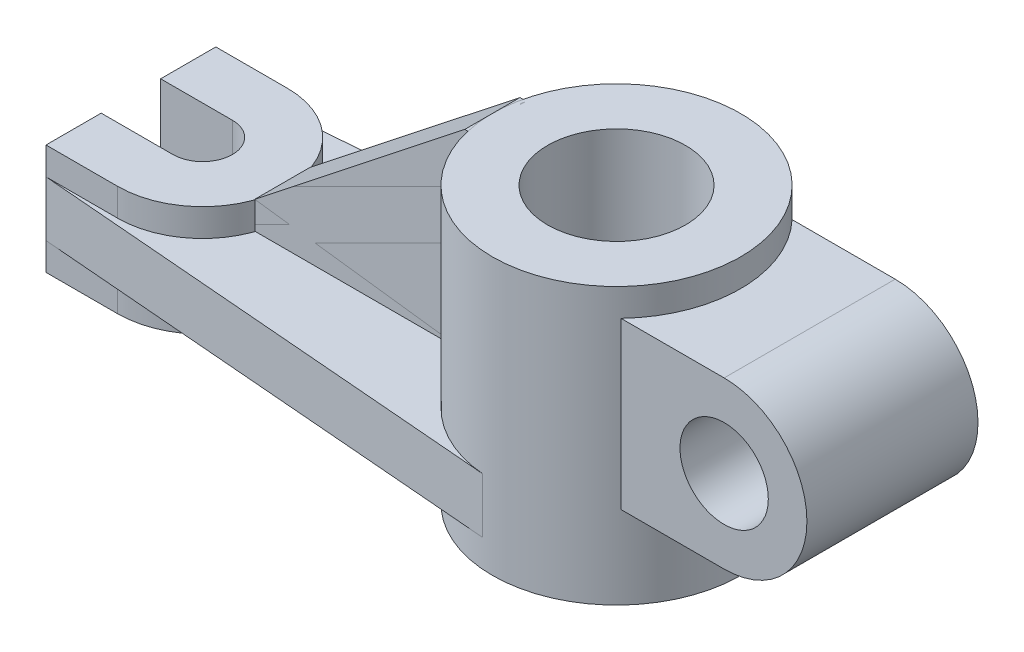
ISO-10303-21;
HEADER;
FILE_DESCRIPTION(('STEP AP214'),'2;1');
FILE_NAME('part.step','',(''),(''),'','','');
FILE_SCHEMA(('AUTOMOTIVE_DESIGN { 1 0 10303 214 1 1 1 1 }'));
ENDSEC;
DATA;
#1=APPLICATION_CONTEXT('core data for automotive mechanical design processes');
#2=APPLICATION_PROTOCOL_DEFINITION('international standard','automotive_design',2000,#1);
#3=PRODUCT_CONTEXT('',#1,'mechanical');
#4=PRODUCT('Part','Part','',(#3));
#5=PRODUCT_RELATED_PRODUCT_CATEGORY('part','',(#4));
#6=PRODUCT_DEFINITION_FORMATION('','',#4);
#7=PRODUCT_DEFINITION_CONTEXT('part definition',#1,'design');
#8=PRODUCT_DEFINITION('design','',#6,#7);
#9=PRODUCT_DEFINITION_SHAPE('','',#8);
#10=(LENGTH_UNIT() NAMED_UNIT(*) SI_UNIT(.MILLI.,.METRE.));
#11=(NAMED_UNIT(*) PLANE_ANGLE_UNIT() SI_UNIT($,.RADIAN.));
#12=(NAMED_UNIT(*) SI_UNIT($,.STERADIAN.) SOLID_ANGLE_UNIT());
#13=UNCERTAINTY_MEASURE_WITH_UNIT(LENGTH_MEASURE(1.E-05),#10,'distance_accuracy_value','');
#14=(GEOMETRIC_REPRESENTATION_CONTEXT(3) GLOBAL_UNCERTAINTY_ASSIGNED_CONTEXT((#13)) GLOBAL_UNIT_ASSIGNED_CONTEXT((#10,
#11,#12)) REPRESENTATION_CONTEXT('',''));
#15=CARTESIAN_POINT('',(0.,0.,0.));
#16=DIRECTION('',(0.,0.,1.));
#17=DIRECTION('',(1.,0.,0.));
#18=AXIS2_PLACEMENT_3D('',#15,#16,#17);
#19=CARTESIAN_POINT('',(-21.3685346332566,15.,5.));
#20=DIRECTION('',(-1.,0.,0.));
#21=DIRECTION('',(0.,-1.,0.));
#22=AXIS2_PLACEMENT_3D('',#19,#20,#21);
#23=PLANE('',#22);
#24=DIRECTION('',(0.,1.,0.));
#25=VECTOR('',#24,1.);
#26=CARTESIAN_POINT('',(-21.3685346332566,15.,-5.));
#27=LINE('',#26,#25);
#28=CARTESIAN_POINT('',(-21.3685346332566,15.,-5.));
#29=VERTEX_POINT('',#28);
#30=CARTESIAN_POINT('',(-21.3685346332566,50.,-5.));
#31=VERTEX_POINT('',#30);
#32=EDGE_CURVE('E140',#29,#31,#27,.T.);
#33=ORIENTED_EDGE('',*,*,#32,.T.);
#34=DIRECTION('',(0.,0.,-1.));
#35=VECTOR('',#34,1.);
#36=CARTESIAN_POINT('',(-21.3685346332566,50.,5.));
#37=LINE('',#36,#35);
#38=CARTESIAN_POINT('',(-21.3685346332566,50.,5.));
#39=VERTEX_POINT('',#38);
#40=EDGE_CURVE('E12',#39,#31,#37,.T.);
#41=ORIENTED_EDGE('',*,*,#40,.F.);
#42=DIRECTION('',(0.,1.,0.));
#43=VECTOR('',#42,1.);
#44=CARTESIAN_POINT('',(-21.3685346332566,15.,5.));
#45=LINE('',#44,#43);
#46=CARTESIAN_POINT('',(-21.3685346332566,15.,5.));
#47=VERTEX_POINT('',#46);
#48=EDGE_CURVE('E153',#47,#39,#45,.T.);
#49=ORIENTED_EDGE('',*,*,#48,.F.);
#50=DIRECTION('',(0.,0.,-1.));
#51=VECTOR('',#50,1.);
#52=CARTESIAN_POINT('',(-21.3685346332566,15.,5.));
#53=LINE('',#52,#51);
#54=EDGE_CURVE('E136',#47,#29,#53,.T.);
#55=ORIENTED_EDGE('',*,*,#54,.T.);
#56=EDGE_LOOP('',(#33,#41,#49,#55));
#57=FACE_BOUND('',#56,.T.);
#58=ADVANCED_FACE('F60',(#57),#23,.F.);
#59=CARTESIAN_POINT('',(-21.3685346332566,50.,5.));
#60=DIRECTION('',(0.,-1.,0.));
#61=DIRECTION('',(0.,0.,-1.));
#62=AXIS2_PLACEMENT_3D('',#59,#60,#61);
#63=PLANE('',#62);
#64=DIRECTION('',(-1.,0.,0.));
#65=VECTOR('',#64,1.);
#66=CARTESIAN_POINT('',(-21.3685346332566,50.,-5.));
#67=LINE('',#66,#65);
#68=CARTESIAN_POINT('',(-22.5,50.,-5.));
#69=VERTEX_POINT('',#68);
#70=EDGE_CURVE('E144',#31,#69,#67,.T.);
#71=ORIENTED_EDGE('',*,*,#70,.T.);
#72=DIRECTION('',(0.,0.,-1.));
#73=VECTOR('',#72,1.);
#74=CARTESIAN_POINT('',(-22.5,50.,5.));
#75=LINE('',#74,#73);
#76=CARTESIAN_POINT('',(-22.5,50.,5.));
#77=VERTEX_POINT('',#76);
#78=EDGE_CURVE('E69',#77,#69,#75,.T.);
#79=ORIENTED_EDGE('',*,*,#78,.F.);
#80=DIRECTION('',(-1.,0.,0.));
#81=VECTOR('',#80,1.);
#82=CARTESIAN_POINT('',(-21.3685346332566,50.,5.));
#83=LINE('',#82,#81);
#84=EDGE_CURVE('E111',#39,#77,#83,.T.);
#85=ORIENTED_EDGE('',*,*,#84,.F.);
#86=ORIENTED_EDGE('',*,*,#40,.T.);
#87=EDGE_LOOP('',(#71,#79,#85,#86));
#88=FACE_BOUND('',#87,.T.);
#89=ADVANCED_FACE('F176',(#88),#63,.F.);
#90=CARTESIAN_POINT('',(-22.5,50.,5.));
#91=DIRECTION('',(0.61900782089987,-0.785384821386812,0.));
#92=DIRECTION('',(0.785384821386812,0.61900782089987,0.));
#93=AXIS2_PLACEMENT_3D('',#90,#91,#92);
#94=PLANE('',#93);
#95=DIRECTION('',(-0.785384821386812,-0.61900782089987,0.));
#96=VECTOR('',#95,1.);
#97=CARTESIAN_POINT('',(-22.5,50.,-5.));
#98=LINE('',#97,#96);
#99=CARTESIAN_POINT('',(-60.5634037989249,20.,-5.));
#100=VERTEX_POINT('',#99);
#101=EDGE_CURVE('E127',#69,#100,#98,.T.);
#102=ORIENTED_EDGE('',*,*,#101,.T.);
#103=DIRECTION('',(0.,0.,-1.));
#104=VECTOR('',#103,1.);
#105=CARTESIAN_POINT('',(-60.5634037989249,20.,5.));
#106=LINE('',#105,#104);
#107=CARTESIAN_POINT('',(-60.5634037989249,20.,5.));
#108=VERTEX_POINT('',#107);
#109=EDGE_CURVE('E124',#108,#100,#106,.T.);
#110=ORIENTED_EDGE('',*,*,#109,.F.);
#111=DIRECTION('',(-0.785384821386812,-0.61900782089987,0.));
#112=VECTOR('',#111,1.);
#113=CARTESIAN_POINT('',(-22.5,50.,5.));
#114=LINE('',#113,#112);
#115=EDGE_CURVE('E115',#77,#108,#114,.T.);
#116=ORIENTED_EDGE('',*,*,#115,.F.);
#117=ORIENTED_EDGE('',*,*,#78,.T.);
#118=EDGE_LOOP('',(#102,#110,#116,#117));
#119=FACE_BOUND('',#118,.T.);
#120=ADVANCED_FACE('F125',(#119),#94,.F.);
#121=CARTESIAN_POINT('',(-60.5634037989249,20.,5.));
#122=DIRECTION('',(1.,0.,0.));
#123=DIRECTION('',(0.,0.,-1.));
#124=AXIS2_PLACEMENT_3D('',#121,#122,#123);
#125=PLANE('',#124);
#126=DIRECTION('',(0.,-1.,0.));
#127=VECTOR('',#126,1.);
#128=CARTESIAN_POINT('',(-60.5634037989249,20.,-5.));
#129=LINE('',#128,#127);
#130=CARTESIAN_POINT('',(-60.5634037989249,15.,-5.));
#131=VERTEX_POINT('',#130);
#132=EDGE_CURVE('E97',#100,#131,#129,.T.);
#133=ORIENTED_EDGE('',*,*,#132,.T.);
#134=DIRECTION('',(0.,0.,-1.));
#135=VECTOR('',#134,1.);
#136=CARTESIAN_POINT('',(-60.5634037989249,15.,5.));
#137=LINE('',#136,#135);
#138=CARTESIAN_POINT('',(-60.5634037989249,15.,5.));
#139=VERTEX_POINT('',#138);
#140=EDGE_CURVE('E129',#139,#131,#137,.T.);
#141=ORIENTED_EDGE('',*,*,#140,.F.);
#142=DIRECTION('',(0.,-1.,0.));
#143=VECTOR('',#142,1.);
#144=CARTESIAN_POINT('',(-60.5634037989249,20.,5.));
#145=LINE('',#144,#143);
#146=EDGE_CURVE('E119',#108,#139,#145,.T.);
#147=ORIENTED_EDGE('',*,*,#146,.F.);
#148=ORIENTED_EDGE('',*,*,#109,.T.);
#149=EDGE_LOOP('',(#133,#141,#147,#148));
#150=FACE_BOUND('',#149,.T.);
#151=ADVANCED_FACE('F131',(#150),#125,.F.);
#152=CARTESIAN_POINT('',(-60.5634037989249,15.,5.));
#153=DIRECTION('',(0.,1.,0.));
#154=DIRECTION('',(0.,0.,1.));
#155=AXIS2_PLACEMENT_3D('',#152,#153,#154);
#156=PLANE('',#155);
#157=DIRECTION('',(1.,0.,0.));
#158=VECTOR('',#157,1.);
#159=CARTESIAN_POINT('',(-60.5634037989249,15.,-5.));
#160=LINE('',#159,#158);
#161=EDGE_CURVE('E103',#131,#29,#160,.T.);
#162=ORIENTED_EDGE('',*,*,#161,.T.);
#163=ORIENTED_EDGE('',*,*,#54,.F.);
#164=DIRECTION('',(1.,0.,0.));
#165=VECTOR('',#164,1.);
#166=CARTESIAN_POINT('',(-60.5634037989249,15.,5.));
#167=LINE('',#166,#165);
#168=EDGE_CURVE('E77',#139,#47,#167,.T.);
#169=ORIENTED_EDGE('',*,*,#168,.F.);
#170=ORIENTED_EDGE('',*,*,#140,.T.);
#171=EDGE_LOOP('',(#162,#163,#169,#170));
#172=FACE_BOUND('',#171,.T.);
#173=ADVANCED_FACE('F165',(#172),#156,.F.);
#174=CARTESIAN_POINT('',(0.,0.,5.));
#175=DIRECTION('',(0.,0.,1.));
#176=DIRECTION('',(1.,0.,0.));
#177=AXIS2_PLACEMENT_3D('',#174,#175,#176);
#178=PLANE('',#177);
#179=ORIENTED_EDGE('',*,*,#48,.T.);
#180=ORIENTED_EDGE('',*,*,#84,.T.);
#181=ORIENTED_EDGE('',*,*,#115,.T.);
#182=ORIENTED_EDGE('',*,*,#146,.T.);
#183=ORIENTED_EDGE('',*,*,#168,.T.);
#184=EDGE_LOOP('',(#179,#180,#181,#182,#183));
#185=FACE_BOUND('',#184,.T.);
#186=ADVANCED_FACE('F117',(#185),#178,.T.);
#187=CARTESIAN_POINT('',(0.,0.,-5.));
#188=DIRECTION('',(0.,0.,1.));
#189=DIRECTION('',(1.,0.,0.));
#190=AXIS2_PLACEMENT_3D('',#187,#188,#189);
#191=PLANE('',#190);
#192=ORIENTED_EDGE('',*,*,#32,.F.);
#193=ORIENTED_EDGE('',*,*,#161,.F.);
#194=ORIENTED_EDGE('',*,*,#132,.F.);
#195=ORIENTED_EDGE('',*,*,#101,.F.);
#196=ORIENTED_EDGE('',*,*,#70,.F.);
#197=EDGE_LOOP('',(#192,#193,#194,#195,#196));
#198=FACE_BOUND('',#197,.T.);
#199=ADVANCED_FACE('F161',(#198),#191,.F.);
#200=CLOSED_SHELL('',(#58,#89,#120,#151,#173,#186,#199));
#201=MANIFOLD_SOLID_BREP('B2',#200);
#202=CARTESIAN_POINT('',(-21.3685346332566,15.,5.));
#203=DIRECTION('',(-1.,0.,0.));
#204=DIRECTION('',(0.,-1.,0.));
#205=AXIS2_PLACEMENT_3D('',#202,#203,#204);
#206=PLANE('',#205);
#207=DIRECTION('',(0.,1.,0.));
#208=VECTOR('',#207,1.);
#209=CARTESIAN_POINT('',(-21.3685346332566,15.,-5.));
#210=LINE('',#209,#208);
#211=CARTESIAN_POINT('',(-21.3685346332566,15.,-5.));
#212=VERTEX_POINT('',#211);
#213=CARTESIAN_POINT('',(-21.3685346332566,50.,-5.));
#214=VERTEX_POINT('',#213);
#215=EDGE_CURVE('E342',#212,#214,#210,.T.);
#216=ORIENTED_EDGE('',*,*,#215,.T.);
#217=DIRECTION('',(0.,0.,-1.));
#218=VECTOR('',#217,1.);
#219=CARTESIAN_POINT('',(-21.3685346332566,50.,5.));
#220=LINE('',#219,#218);
#221=CARTESIAN_POINT('',(-21.3685346332566,50.,5.));
#222=VERTEX_POINT('',#221);
#223=EDGE_CURVE('E58',#222,#214,#220,.T.);
#224=ORIENTED_EDGE('',*,*,#223,.F.);
#225=DIRECTION('',(0.,1.,0.));
#226=VECTOR('',#225,1.);
#227=CARTESIAN_POINT('',(-21.3685346332566,15.,5.));
#228=LINE('',#227,#226);
#229=CARTESIAN_POINT('',(-21.3685346332566,15.,5.));
#230=VERTEX_POINT('',#229);
#231=EDGE_CURVE('E355',#230,#222,#228,.T.);
#232=ORIENTED_EDGE('',*,*,#231,.F.);
#233=DIRECTION('',(0.,0.,-1.));
#234=VECTOR('',#233,1.);
#235=CARTESIAN_POINT('',(-21.3685346332566,15.,5.));
#236=LINE('',#235,#234);
#237=EDGE_CURVE('E338',#230,#212,#236,.T.);
#238=ORIENTED_EDGE('',*,*,#237,.T.);
#239=EDGE_LOOP('',(#216,#224,#232,#238));
#240=FACE_BOUND('',#239,.T.);
#241=ADVANCED_FACE('F262',(#240),#206,.F.);
#242=CARTESIAN_POINT('',(-21.3685346332566,50.,5.));
#243=DIRECTION('',(0.,-1.,0.));
#244=DIRECTION('',(0.,0.,-1.));
#245=AXIS2_PLACEMENT_3D('',#242,#243,#244);
#246=PLANE('',#245);
#247=DIRECTION('',(-1.,0.,0.));
#248=VECTOR('',#247,1.);
#249=CARTESIAN_POINT('',(-21.3685346332566,50.,-5.));
#250=LINE('',#249,#248);
#251=CARTESIAN_POINT('',(-22.5,50.,-5.));
#252=VERTEX_POINT('',#251);
#253=EDGE_CURVE('E346',#214,#252,#250,.T.);
#254=ORIENTED_EDGE('',*,*,#253,.T.);
#255=DIRECTION('',(0.,0.,-1.));
#256=VECTOR('',#255,1.);
#257=CARTESIAN_POINT('',(-22.5,50.,5.));
#258=LINE('',#257,#256);
#259=CARTESIAN_POINT('',(-22.5,50.,5.));
#260=VERTEX_POINT('',#259);
#261=EDGE_CURVE('E271',#260,#252,#258,.T.);
#262=ORIENTED_EDGE('',*,*,#261,.F.);
#263=DIRECTION('',(-1.,0.,0.));
#264=VECTOR('',#263,1.);
#265=CARTESIAN_POINT('',(-21.3685346332566,50.,5.));
#266=LINE('',#265,#264);
#267=EDGE_CURVE('E313',#222,#260,#266,.T.);
#268=ORIENTED_EDGE('',*,*,#267,.F.);
#269=ORIENTED_EDGE('',*,*,#223,.T.);
#270=EDGE_LOOP('',(#254,#262,#268,#269));
#271=FACE_BOUND('',#270,.T.);
#272=ADVANCED_FACE('F378',(#271),#246,.F.);
#273=CARTESIAN_POINT('',(-22.5,50.,5.));
#274=DIRECTION('',(0.61900782089987,-0.785384821386812,0.));
#275=DIRECTION('',(0.785384821386812,0.61900782089987,0.));
#276=AXIS2_PLACEMENT_3D('',#273,#274,#275);
#277=PLANE('',#276);
#278=DIRECTION('',(-0.785384821386812,-0.61900782089987,0.));
#279=VECTOR('',#278,1.);
#280=CARTESIAN_POINT('',(-22.5,50.,-5.));
#281=LINE('',#280,#279);
#282=CARTESIAN_POINT('',(-60.5634037989249,20.,-5.));
#283=VERTEX_POINT('',#282);
#284=EDGE_CURVE('E329',#252,#283,#281,.T.);
#285=ORIENTED_EDGE('',*,*,#284,.T.);
#286=DIRECTION('',(0.,0.,-1.));
#287=VECTOR('',#286,1.);
#288=CARTESIAN_POINT('',(-60.5634037989249,20.,5.));
#289=LINE('',#288,#287);
#290=CARTESIAN_POINT('',(-60.5634037989249,20.,5.));
#291=VERTEX_POINT('',#290);
#292=EDGE_CURVE('E326',#291,#283,#289,.T.);
#293=ORIENTED_EDGE('',*,*,#292,.F.);
#294=DIRECTION('',(-0.785384821386812,-0.61900782089987,0.));
#295=VECTOR('',#294,1.);
#296=CARTESIAN_POINT('',(-22.5,50.,5.));
#297=LINE('',#296,#295);
#298=EDGE_CURVE('E317',#260,#291,#297,.T.);
#299=ORIENTED_EDGE('',*,*,#298,.F.);
#300=ORIENTED_EDGE('',*,*,#261,.T.);
#301=EDGE_LOOP('',(#285,#293,#299,#300));
#302=FACE_BOUND('',#301,.T.);
#303=ADVANCED_FACE('F327',(#302),#277,.F.);
#304=CARTESIAN_POINT('',(-60.5634037989249,20.,5.));
#305=DIRECTION('',(1.,0.,0.));
#306=DIRECTION('',(0.,0.,-1.));
#307=AXIS2_PLACEMENT_3D('',#304,#305,#306);
#308=PLANE('',#307);
#309=DIRECTION('',(0.,-1.,0.));
#310=VECTOR('',#309,1.);
#311=CARTESIAN_POINT('',(-60.5634037989249,20.,-5.));
#312=LINE('',#311,#310);
#313=CARTESIAN_POINT('',(-60.5634037989249,15.,-5.));
#314=VERTEX_POINT('',#313);
#315=EDGE_CURVE('E299',#283,#314,#312,.T.);
#316=ORIENTED_EDGE('',*,*,#315,.T.);
#317=DIRECTION('',(0.,0.,-1.));
#318=VECTOR('',#317,1.);
#319=CARTESIAN_POINT('',(-60.5634037989249,15.,5.));
#320=LINE('',#319,#318);
#321=CARTESIAN_POINT('',(-60.5634037989249,15.,5.));
#322=VERTEX_POINT('',#321);
#323=EDGE_CURVE('E331',#322,#314,#320,.T.);
#324=ORIENTED_EDGE('',*,*,#323,.F.);
#325=DIRECTION('',(0.,-1.,0.));
#326=VECTOR('',#325,1.);
#327=CARTESIAN_POINT('',(-60.5634037989249,20.,5.));
#328=LINE('',#327,#326);
#329=EDGE_CURVE('E321',#291,#322,#328,.T.);
#330=ORIENTED_EDGE('',*,*,#329,.F.);
#331=ORIENTED_EDGE('',*,*,#292,.T.);
#332=EDGE_LOOP('',(#316,#324,#330,#331));
#333=FACE_BOUND('',#332,.T.);
#334=ADVANCED_FACE('F333',(#333),#308,.F.);
#335=CARTESIAN_POINT('',(-60.5634037989249,15.,5.));
#336=DIRECTION('',(0.,1.,0.));
#337=DIRECTION('',(0.,0.,1.));
#338=AXIS2_PLACEMENT_3D('',#335,#336,#337);
#339=PLANE('',#338);
#340=DIRECTION('',(1.,0.,0.));
#341=VECTOR('',#340,1.);
#342=CARTESIAN_POINT('',(-60.5634037989249,15.,-5.));
#343=LINE('',#342,#341);
#344=EDGE_CURVE('E305',#314,#212,#343,.T.);
#345=ORIENTED_EDGE('',*,*,#344,.T.);
#346=ORIENTED_EDGE('',*,*,#237,.F.);
#347=DIRECTION('',(1.,0.,0.));
#348=VECTOR('',#347,1.);
#349=CARTESIAN_POINT('',(-60.5634037989249,15.,5.));
#350=LINE('',#349,#348);
#351=EDGE_CURVE('E279',#322,#230,#350,.T.);
#352=ORIENTED_EDGE('',*,*,#351,.F.);
#353=ORIENTED_EDGE('',*,*,#323,.T.);
#354=EDGE_LOOP('',(#345,#346,#352,#353));
#355=FACE_BOUND('',#354,.T.);
#356=ADVANCED_FACE('F367',(#355),#339,.F.);
#357=CARTESIAN_POINT('',(0.,0.,5.));
#358=DIRECTION('',(0.,0.,1.));
#359=DIRECTION('',(1.,0.,0.));
#360=AXIS2_PLACEMENT_3D('',#357,#358,#359);
#361=PLANE('',#360);
#362=ORIENTED_EDGE('',*,*,#231,.T.);
#363=ORIENTED_EDGE('',*,*,#267,.T.);
#364=ORIENTED_EDGE('',*,*,#298,.T.);
#365=ORIENTED_EDGE('',*,*,#329,.T.);
#366=ORIENTED_EDGE('',*,*,#351,.T.);
#367=EDGE_LOOP('',(#362,#363,#364,#365,#366));
#368=FACE_BOUND('',#367,.T.);
#369=ADVANCED_FACE('F319',(#368),#361,.T.);
#370=CARTESIAN_POINT('',(0.,0.,-5.));
#371=DIRECTION('',(0.,0.,1.));
#372=DIRECTION('',(1.,0.,0.));
#373=AXIS2_PLACEMENT_3D('',#370,#371,#372);
#374=PLANE('',#373);
#375=ORIENTED_EDGE('',*,*,#215,.F.);
#376=ORIENTED_EDGE('',*,*,#344,.F.);
#377=ORIENTED_EDGE('',*,*,#315,.F.);
#378=ORIENTED_EDGE('',*,*,#284,.F.);
#379=ORIENTED_EDGE('',*,*,#253,.F.);
#380=EDGE_LOOP('',(#375,#376,#377,#378,#379));
#381=FACE_BOUND('',#380,.T.);
#382=ADVANCED_FACE('F363',(#381),#374,.F.);
#383=CLOSED_SHELL('',(#241,#272,#303,#334,#356,#369,#382));
#384=MANIFOLD_SOLID_BREP('B6_NOT_SHOWN',#383);
#385=CARTESIAN_POINT('',(0.,50.,0.));
#386=DIRECTION('',(0.,-1.,0.));
#387=DIRECTION('',(0.,0.,-1.));
#388=AXIS2_PLACEMENT_3D('',#385,#386,#387);
#389=CYLINDRICAL_SURFACE('',#388,22.5);
#390=DIRECTION('',(0.,-1.,0.));
#391=VECTOR('',#390,1.);
#392=CARTESIAN_POINT('',(16.3095064303001,45.,15.5));
#393=LINE('',#392,#391);
#394=CARTESIAN_POINT('',(16.3095064303001,45.,15.5));
#395=VERTEX_POINT('',#394);
#396=CARTESIAN_POINT('',(16.3095064303001,15.,15.5));
#397=VERTEX_POINT('',#396);
#398=EDGE_CURVE('E478',#395,#397,#393,.T.);
#399=ORIENTED_EDGE('',*,*,#398,.F.);
#400=CARTESIAN_POINT('',(0.,45.,0.));
#401=DIRECTION('',(0.,1.,0.));
#402=DIRECTION('',(0.,0.,1.));
#403=AXIS2_PLACEMENT_3D('',#400,#401,#402);
#404=CIRCLE('',#403,22.5);
#405=CARTESIAN_POINT('',(16.3095064303001,45.,-15.5));
#406=VERTEX_POINT('',#405);
#407=EDGE_CURVE('E473',#395,#406,#404,.T.);
#408=ORIENTED_EDGE('',*,*,#407,.T.);
#409=DIRECTION('',(0.,-1.,0.));
#410=VECTOR('',#409,1.);
#411=CARTESIAN_POINT('',(16.3095064303001,45.,-15.5));
#412=LINE('',#411,#410);
#413=CARTESIAN_POINT('',(16.3095064303001,15.,-15.5));
#414=VERTEX_POINT('',#413);
#415=EDGE_CURVE('E632',#406,#414,#412,.T.);
#416=ORIENTED_EDGE('',*,*,#415,.T.);
#417=CARTESIAN_POINT('',(0.,15.,0.));
#418=DIRECTION('',(0.,1.,0.));
#419=DIRECTION('',(0.,0.,1.));
#420=AXIS2_PLACEMENT_3D('',#417,#418,#419);
#421=CIRCLE('',#420,22.5);
#422=EDGE_CURVE('E587',#397,#414,#421,.T.);
#423=ORIENTED_EDGE('',*,*,#422,.F.);
#424=EDGE_LOOP('',(#399,#408,#416,#423));
#425=FACE_BOUND('',#424,.T.);
#426=DIRECTION('',(0.,-1.,0.));
#427=VECTOR('',#426,1.);
#428=CARTESIAN_POINT('',(-1.83162562672284,15.,-22.4253238006396));
#429=LINE('',#428,#427);
#430=CARTESIAN_POINT('',(-1.83162562672284,15.,-22.4253238006396));
#431=VERTEX_POINT('',#430);
#432=CARTESIAN_POINT('',(-1.83162562672284,5.,-22.4253238006396));
#433=VERTEX_POINT('',#432);
#434=EDGE_CURVE('E780',#431,#433,#429,.T.);
#435=ORIENTED_EDGE('',*,*,#434,.F.);
#436=CARTESIAN_POINT('',(0.,15.,0.));
#437=DIRECTION('',(0.,1.,0.));
#438=DIRECTION('',(0.,0.,1.));
#439=AXIS2_PLACEMENT_3D('',#436,#437,#438);
#440=CIRCLE('',#439,22.5);
#441=CARTESIAN_POINT('',(-1.83162562683852,15.,22.4253238006301));
#442=VERTEX_POINT('',#441);
#443=EDGE_CURVE('E725',#431,#442,#440,.T.);
#444=ORIENTED_EDGE('',*,*,#443,.T.);
#445=DIRECTION('',(0.,-1.,0.));
#446=VECTOR('',#445,1.);
#447=CARTESIAN_POINT('',(-1.83162562683852,15.,22.4253238006301));
#448=LINE('',#447,#446);
#449=CARTESIAN_POINT('',(-1.83162562683852,5.,22.4253238006301));
#450=VERTEX_POINT('',#449);
#451=EDGE_CURVE('E747',#442,#450,#448,.T.);
#452=ORIENTED_EDGE('',*,*,#451,.T.);
#453=CARTESIAN_POINT('',(0.,5.,0.));
#454=DIRECTION('',(0.,1.,0.));
#455=DIRECTION('',(0.,0.,1.));
#456=AXIS2_PLACEMENT_3D('',#453,#454,#455);
#457=CIRCLE('',#456,22.5);
#458=EDGE_CURVE('E724',#433,#450,#457,.T.);
#459=ORIENTED_EDGE('',*,*,#458,.F.);
#460=EDGE_LOOP('',(#435,#444,#452,#459));
#461=FACE_BOUND('',#460,.T.);
#462=CARTESIAN_POINT('',(0.,50.,0.));
#463=DIRECTION('',(0.,1.,0.));
#464=DIRECTION('',(0.,0.,1.));
#465=AXIS2_PLACEMENT_3D('',#462,#463,#464);
#466=CIRCLE('',#465,22.5);
#467=CARTESIAN_POINT('',(0.,50.,22.5));
#468=VERTEX_POINT('',#467);
#469=EDGE_CURVE('E465',#468,#468,#466,.T.);
#470=ORIENTED_EDGE('',*,*,#469,.F.);
#471=EDGE_LOOP('',(#470));
#472=FACE_BOUND('',#471,.T.);
#473=CARTESIAN_POINT('',(0.,0.,0.));
#474=DIRECTION('',(0.,1.,0.));
#475=DIRECTION('',(0.,0.,1.));
#476=AXIS2_PLACEMENT_3D('',#473,#474,#475);
#477=CIRCLE('',#476,22.5);
#478=CARTESIAN_POINT('',(0.,0.,22.5));
#479=VERTEX_POINT('',#478);
#480=EDGE_CURVE('E784',#479,#479,#477,.T.);
#481=ORIENTED_EDGE('',*,*,#480,.T.);
#482=EDGE_LOOP('',(#481));
#483=FACE_BOUND('',#482,.T.);
#484=ADVANCED_FACE('F456',(#425,#461,#472,#483),#389,.T.);
#485=CARTESIAN_POINT('',(0.,50.,0.));
#486=DIRECTION('',(0.,-1.,0.));
#487=DIRECTION('',(0.,0.,-1.));
#488=AXIS2_PLACEMENT_3D('',#485,#486,#487);
#489=CYLINDRICAL_SURFACE('',#488,12.5);
#490=CARTESIAN_POINT('',(0.,50.,0.));
#491=DIRECTION('',(0.,1.,0.));
#492=DIRECTION('',(0.,0.,1.));
#493=AXIS2_PLACEMENT_3D('',#490,#491,#492);
#494=CIRCLE('',#493,12.5);
#495=CARTESIAN_POINT('',(0.,50.,12.5));
#496=VERTEX_POINT('',#495);
#497=EDGE_CURVE('E260',#496,#496,#494,.T.);
#498=ORIENTED_EDGE('',*,*,#497,.T.);
#499=EDGE_LOOP('',(#498));
#500=FACE_BOUND('',#499,.T.);
#501=CARTESIAN_POINT('',(0.,0.,0.));
#502=DIRECTION('',(0.,1.,0.));
#503=DIRECTION('',(0.,0.,1.));
#504=AXIS2_PLACEMENT_3D('',#501,#502,#503);
#505=CIRCLE('',#504,12.5);
#506=CARTESIAN_POINT('',(0.,0.,12.5));
#507=VERTEX_POINT('',#506);
#508=EDGE_CURVE('E787',#507,#507,#505,.T.);
#509=ORIENTED_EDGE('',*,*,#508,.F.);
#510=EDGE_LOOP('',(#509));
#511=FACE_BOUND('',#510,.T.);
#512=ADVANCED_FACE('F798',(#500,#511),#489,.F.);
#513=CARTESIAN_POINT('',(0.,50.,0.));
#514=DIRECTION('',(0.,1.,0.));
#515=DIRECTION('',(0.,0.,1.));
#516=AXIS2_PLACEMENT_3D('',#513,#514,#515);
#517=PLANE('',#516);
#518=ORIENTED_EDGE('',*,*,#469,.T.);
#519=EDGE_LOOP('',(#518));
#520=FACE_BOUND('',#519,.T.);
#521=ORIENTED_EDGE('',*,*,#497,.F.);
#522=EDGE_LOOP('',(#521));
#523=FACE_BOUND('',#522,.T.);
#524=ADVANCED_FACE('F800',(#520,#523),#517,.T.);
#525=CARTESIAN_POINT('',(0.,0.,0.));
#526=DIRECTION('',(0.,1.,0.));
#527=DIRECTION('',(0.,0.,1.));
#528=AXIS2_PLACEMENT_3D('',#525,#526,#527);
#529=PLANE('',#528);
#530=ORIENTED_EDGE('',*,*,#480,.F.);
#531=EDGE_LOOP('',(#530));
#532=FACE_BOUND('',#531,.T.);
#533=ORIENTED_EDGE('',*,*,#508,.T.);
#534=EDGE_LOOP('',(#533));
#535=FACE_BOUND('',#534,.T.);
#536=ADVANCED_FACE('F796',(#532,#535),#529,.F.);
#537=CARTESIAN_POINT('',(-1.83162562672284,15.,-22.4253238006396));
#538=DIRECTION('',(-0.0814055834099039,0.,-0.996681057806204));
#539=DIRECTION('',(-0.996681057806204,0.,0.0814055834099039));
#540=AXIS2_PLACEMENT_3D('',#537,#538,#539);
#541=PLANE('',#540);
#542=DIRECTION('',(0.996681057806204,0.,-0.0814055834099039));
#543=VECTOR('',#542,1.);
#544=CARTESIAN_POINT('',(-1.83162562672284,5.,-22.4253238006396));
#545=LINE('',#544,#543);
#546=CARTESIAN_POINT('',(-88.,5.,-15.3873784796164));
#547=VERTEX_POINT('',#546);
#548=EDGE_CURVE('E751',#547,#433,#545,.T.);
#549=ORIENTED_EDGE('',*,*,#548,.F.);
#550=DIRECTION('',(0.,-1.,0.));
#551=VECTOR('',#550,1.);
#552=CARTESIAN_POINT('',(-88.,15.,-15.3873784796164));
#553=LINE('',#552,#551);
#554=CARTESIAN_POINT('',(-88.,15.,-15.3873784796164));
#555=VERTEX_POINT('',#554);
#556=EDGE_CURVE('E776',#555,#547,#553,.T.);
#557=ORIENTED_EDGE('',*,*,#556,.F.);
#558=DIRECTION('',(0.996681057806204,0.,-0.0814055834099039));
#559=VECTOR('',#558,1.);
#560=CARTESIAN_POINT('',(-1.83162562672284,15.,-22.4253238006396));
#561=LINE('',#560,#559);
#562=EDGE_CURVE('E728',#555,#431,#561,.T.);
#563=ORIENTED_EDGE('',*,*,#562,.T.);
#564=ORIENTED_EDGE('',*,*,#434,.T.);
#565=EDGE_LOOP('',(#549,#557,#563,#564));
#566=FACE_BOUND('',#565,.T.);
#567=ADVANCED_FACE('F810',(#566),#541,.T.);
#568=CARTESIAN_POINT('',(-1.83162562683852,15.,22.4253238006301));
#569=DIRECTION('',(0.0814055834150455,0.,-0.996681057805784));
#570=DIRECTION('',(-0.996681057805784,0.,-0.0814055834150455));
#571=AXIS2_PLACEMENT_3D('',#568,#569,#570);
#572=PLANE('',#571);
#573=DIRECTION('',(0.996681057805784,0.,0.0814055834150455));
#574=VECTOR('',#573,1.);
#575=CARTESIAN_POINT('',(-1.83162562683852,5.,22.4253238006301));
#576=LINE('',#575,#574);
#577=CARTESIAN_POINT('',(-87.9999999945211,5.,15.3873784796164));
#578=VERTEX_POINT('',#577);
#579=EDGE_CURVE('E729',#578,#450,#576,.T.);
#580=ORIENTED_EDGE('',*,*,#579,.T.);
#581=ORIENTED_EDGE('',*,*,#451,.F.);
#582=DIRECTION('',(0.996681057805784,0.,0.0814055834150455));
#583=VECTOR('',#582,1.);
#584=CARTESIAN_POINT('',(-1.83162562683852,15.,22.4253238006301));
#585=LINE('',#584,#583);
#586=CARTESIAN_POINT('',(-87.9999999945211,15.,15.3873784796164));
#587=VERTEX_POINT('',#586);
#588=EDGE_CURVE('E743',#587,#442,#585,.T.);
#589=ORIENTED_EDGE('',*,*,#588,.F.);
#590=DIRECTION('',(0.,-1.,0.));
#591=VECTOR('',#590,1.);
#592=CARTESIAN_POINT('',(-87.9999999945211,15.,15.3873784796164));
#593=LINE('',#592,#591);
#594=EDGE_CURVE('E772',#587,#578,#593,.T.);
#595=ORIENTED_EDGE('',*,*,#594,.T.);
#596=EDGE_LOOP('',(#580,#581,#589,#595));
#597=FACE_BOUND('',#596,.T.);
#598=ADVANCED_FACE('F815',(#597),#572,.F.);
#599=CARTESIAN_POINT('',(0.,15.,0.));
#600=DIRECTION('',(0.,1.,0.));
#601=DIRECTION('',(0.,0.,1.));
#602=AXIS2_PLACEMENT_3D('',#599,#600,#601);
#603=PLANE('',#602);
#604=ORIENTED_EDGE('',*,*,#443,.F.);
#605=ORIENTED_EDGE('',*,*,#562,.F.);
#606=DIRECTION('',(-1.,0.,0.));
#607=VECTOR('',#606,1.);
#608=CARTESIAN_POINT('',(0.,15.,-15.3873784796164));
#609=LINE('',#608,#607);
#610=CARTESIAN_POINT('',(-75.,15.,-15.3873784796164));
#611=VERTEX_POINT('',#610);
#612=EDGE_CURVE('E733',#611,#555,#609,.T.);
#613=ORIENTED_EDGE('',*,*,#612,.F.);
#614=CARTESIAN_POINT('',(-75.,15.,0.));
#615=DIRECTION('',(0.,1.,0.));
#616=DIRECTION('',(0.,0.,1.));
#617=AXIS2_PLACEMENT_3D('',#614,#615,#616);
#618=CIRCLE('',#617,15.3873784796164);
#619=CARTESIAN_POINT('',(-74.9999999945211,15.,15.3873784796164));
#620=VERTEX_POINT('',#619);
#621=EDGE_CURVE('E736',#611,#620,#618,.F.);
#622=ORIENTED_EDGE('',*,*,#621,.T.);
#623=DIRECTION('',(1.,0.,0.));
#624=VECTOR('',#623,1.);
#625=CARTESIAN_POINT('',(0.,15.,15.3873784796164));
#626=LINE('',#625,#624);
#627=EDGE_CURVE('E740',#587,#620,#626,.T.);
#628=ORIENTED_EDGE('',*,*,#627,.F.);
#629=ORIENTED_EDGE('',*,*,#588,.T.);
#630=EDGE_LOOP('',(#604,#605,#613,#622,#628,#629));
#631=FACE_BOUND('',#630,.T.);
#632=ADVANCED_FACE('F819',(#631),#603,.T.);
#633=CARTESIAN_POINT('',(0.,5.,0.));
#634=DIRECTION('',(0.,1.,0.));
#635=DIRECTION('',(0.,0.,1.));
#636=AXIS2_PLACEMENT_3D('',#633,#634,#635);
#637=PLANE('',#636);
#638=ORIENTED_EDGE('',*,*,#458,.T.);
#639=ORIENTED_EDGE('',*,*,#579,.F.);
#640=DIRECTION('',(1.,0.,0.));
#641=VECTOR('',#640,1.);
#642=CARTESIAN_POINT('',(0.,5.,15.3873784796164));
#643=LINE('',#642,#641);
#644=CARTESIAN_POINT('',(-74.9999999945211,5.,15.3873784796164));
#645=VERTEX_POINT('',#644);
#646=EDGE_CURVE('E763',#578,#645,#643,.T.);
#647=ORIENTED_EDGE('',*,*,#646,.T.);
#648=CARTESIAN_POINT('',(-75.,5.,0.));
#649=DIRECTION('',(0.,1.,0.));
#650=DIRECTION('',(0.,0.,1.));
#651=AXIS2_PLACEMENT_3D('',#648,#649,#650);
#652=CIRCLE('',#651,15.3873784796164);
#653=CARTESIAN_POINT('',(-75.,5.,-15.3873784796164));
#654=VERTEX_POINT('',#653);
#655=EDGE_CURVE('E759',#654,#645,#652,.F.);
#656=ORIENTED_EDGE('',*,*,#655,.F.);
#657=DIRECTION('',(-1.,0.,0.));
#658=VECTOR('',#657,1.);
#659=CARTESIAN_POINT('',(0.,5.,-15.3873784796164));
#660=LINE('',#659,#658);
#661=EDGE_CURVE('E755',#654,#547,#660,.T.);
#662=ORIENTED_EDGE('',*,*,#661,.T.);
#663=ORIENTED_EDGE('',*,*,#548,.T.);
#664=EDGE_LOOP('',(#638,#639,#647,#656,#662,#663));
#665=FACE_BOUND('',#664,.T.);
#666=ADVANCED_FACE('F821',(#665),#637,.F.);
#667=CARTESIAN_POINT('',(-75.,20.,0.));
#668=DIRECTION('',(0.,-1.,0.));
#669=DIRECTION('',(0.,0.,-1.));
#670=AXIS2_PLACEMENT_3D('',#667,#668,#669);
#671=CYLINDRICAL_SURFACE('',#670,15.3873784796164);
#672=ORIENTED_EDGE('',*,*,#655,.T.);
#673=DIRECTION('',(0.,-1.,0.));
#674=VECTOR('',#673,1.);
#675=CARTESIAN_POINT('',(-74.9999999945211,20.,15.3873784796164));
#676=LINE('',#675,#674);
#677=CARTESIAN_POINT('',(-74.9999999945211,0.,15.3873784796164));
#678=VERTEX_POINT('',#677);
#679=EDGE_CURVE('E662',#645,#678,#676,.T.);
#680=ORIENTED_EDGE('',*,*,#679,.T.);
#681=CARTESIAN_POINT('',(-75.,0.,0.));
#682=DIRECTION('',(0.,1.,0.));
#683=DIRECTION('',(0.,0.,1.));
#684=AXIS2_PLACEMENT_3D('',#681,#682,#683);
#685=CIRCLE('',#684,15.3873784796164);
#686=CARTESIAN_POINT('',(-75.,0.,-15.3873784796164));
#687=VERTEX_POINT('',#686);
#688=EDGE_CURVE('E635',#687,#678,#685,.F.);
#689=ORIENTED_EDGE('',*,*,#688,.F.);
#690=DIRECTION('',(0.,-1.,0.));
#691=VECTOR('',#690,1.);
#692=CARTESIAN_POINT('',(-75.,20.,-15.3873784796164));
#693=LINE('',#692,#691);
#694=EDGE_CURVE('E719',#654,#687,#693,.T.);
#695=ORIENTED_EDGE('',*,*,#694,.F.);
#696=EDGE_LOOP('',(#672,#680,#689,#695));
#697=FACE_BOUND('',#696,.T.);
#698=ADVANCED_FACE('F824',(#697),#671,.T.);
#699=CARTESIAN_POINT('',(0.,20.,-15.3873784796164));
#700=DIRECTION('',(0.,0.,1.));
#701=DIRECTION('',(1.,0.,0.));
#702=AXIS2_PLACEMENT_3D('',#699,#700,#701);
#703=PLANE('',#702);
#704=DIRECTION('',(0.,-1.,0.));
#705=VECTOR('',#704,1.);
#706=CARTESIAN_POINT('',(-88.,20.,-15.3873784796164));
#707=LINE('',#706,#705);
#708=CARTESIAN_POINT('',(-88.,0.,-15.3873784796164));
#709=VERTEX_POINT('',#708);
#710=EDGE_CURVE('E714',#547,#709,#707,.T.);
#711=ORIENTED_EDGE('',*,*,#710,.F.);
#712=ORIENTED_EDGE('',*,*,#661,.F.);
#713=ORIENTED_EDGE('',*,*,#694,.T.);
#714=DIRECTION('',(-1.,0.,0.));
#715=VECTOR('',#714,1.);
#716=CARTESIAN_POINT('',(0.,0.,-15.3873784796164));
#717=LINE('',#716,#715);
#718=EDGE_CURVE('E666',#687,#709,#717,.T.);
#719=ORIENTED_EDGE('',*,*,#718,.T.);
#720=EDGE_LOOP('',(#711,#712,#713,#719));
#721=FACE_BOUND('',#720,.T.);
#722=ADVANCED_FACE('F839',(#721),#703,.F.);
#723=CARTESIAN_POINT('',(0.,20.,15.3873784796164));
#724=DIRECTION('',(0.,0.,-1.));
#725=DIRECTION('',(-1.,0.,0.));
#726=AXIS2_PLACEMENT_3D('',#723,#724,#725);
#727=PLANE('',#726);
#728=ORIENTED_EDGE('',*,*,#679,.F.);
#729=ORIENTED_EDGE('',*,*,#646,.F.);
#730=DIRECTION('',(0.,-1.,0.));
#731=VECTOR('',#730,1.);
#732=CARTESIAN_POINT('',(-87.9999999945211,20.,15.3873784796164));
#733=LINE('',#732,#731);
#734=CARTESIAN_POINT('',(-87.9999999945211,0.,15.3873784796164));
#735=VERTEX_POINT('',#734);
#736=EDGE_CURVE('E693',#578,#735,#733,.T.);
#737=ORIENTED_EDGE('',*,*,#736,.T.);
#738=DIRECTION('',(1.,0.,0.));
#739=VECTOR('',#738,1.);
#740=CARTESIAN_POINT('',(0.,0.,15.3873784796164));
#741=LINE('',#740,#739);
#742=EDGE_CURVE('E641',#735,#678,#741,.T.);
#743=ORIENTED_EDGE('',*,*,#742,.T.);
#744=EDGE_LOOP('',(#728,#729,#737,#743));
#745=FACE_BOUND('',#744,.T.);
#746=ADVANCED_FACE('F833',(#745),#727,.F.);
#747=CARTESIAN_POINT('',(-74.9999999945211,20.,15.3873784796164));
#748=VERTEX_POINT('',#747);
#749=EDGE_CURVE('E689',#748,#620,#676,.T.);
#750=ORIENTED_EDGE('',*,*,#749,.T.);
#751=ORIENTED_EDGE('',*,*,#621,.F.);
#752=CARTESIAN_POINT('',(-75.,20.,-15.3873784796164));
#753=VERTEX_POINT('',#752);
#754=EDGE_CURVE('E720',#753,#611,#693,.T.);
#755=ORIENTED_EDGE('',*,*,#754,.F.);
#756=CARTESIAN_POINT('',(-75.,20.,0.));
#757=DIRECTION('',(0.,1.,0.));
#758=DIRECTION('',(0.,0.,1.));
#759=AXIS2_PLACEMENT_3D('',#756,#757,#758);
#760=CIRCLE('',#759,15.3873784796164);
#761=EDGE_CURVE('E636',#753,#748,#760,.F.);
#762=ORIENTED_EDGE('',*,*,#761,.T.);
#763=EDGE_LOOP('',(#750,#751,#755,#762));
#764=FACE_BOUND('',#763,.T.);
#765=ADVANCED_FACE('F829',(#764),#671,.T.);
#766=ORIENTED_EDGE('',*,*,#612,.T.);
#767=CARTESIAN_POINT('',(-88.,20.,-15.3873784796164));
#768=VERTEX_POINT('',#767);
#769=EDGE_CURVE('E715',#768,#555,#707,.T.);
#770=ORIENTED_EDGE('',*,*,#769,.F.);
#771=DIRECTION('',(-1.,0.,0.));
#772=VECTOR('',#771,1.);
#773=CARTESIAN_POINT('',(0.,20.,-15.3873784796164));
#774=LINE('',#773,#772);
#775=EDGE_CURVE('E640',#753,#768,#774,.T.);
#776=ORIENTED_EDGE('',*,*,#775,.F.);
#777=ORIENTED_EDGE('',*,*,#754,.T.);
#778=EDGE_LOOP('',(#766,#770,#776,#777));
#779=FACE_BOUND('',#778,.T.);
#780=ADVANCED_FACE('F832',(#779),#703,.F.);
#781=CARTESIAN_POINT('',(-88.,20.,0.));
#782=DIRECTION('',(1.,0.,0.));
#783=DIRECTION('',(0.,0.,-1.));
#784=AXIS2_PLACEMENT_3D('',#781,#782,#783);
#785=PLANE('',#784);
#786=DIRECTION('',(0.,0.,1.));
#787=VECTOR('',#786,1.);
#788=CARTESIAN_POINT('',(-88.,0.,0.));
#789=LINE('',#788,#787);
#790=CARTESIAN_POINT('',(-88.,0.,-5.38737847961637));
#791=VERTEX_POINT('',#790);
#792=EDGE_CURVE('E670',#709,#791,#789,.T.);
#793=ORIENTED_EDGE('',*,*,#792,.T.);
#794=DIRECTION('',(0.,-1.,0.));
#795=VECTOR('',#794,1.);
#796=CARTESIAN_POINT('',(-88.,20.,-5.38737847961637));
#797=LINE('',#796,#795);
#798=CARTESIAN_POINT('',(-88.,20.,-5.38737847961637));
#799=VERTEX_POINT('',#798);
#800=EDGE_CURVE('E710',#799,#791,#797,.T.);
#801=ORIENTED_EDGE('',*,*,#800,.F.);
#802=DIRECTION('',(0.,0.,1.));
#803=VECTOR('',#802,1.);
#804=CARTESIAN_POINT('',(-88.,20.,0.));
#805=LINE('',#804,#803);
#806=EDGE_CURVE('E644',#768,#799,#805,.T.);
#807=ORIENTED_EDGE('',*,*,#806,.F.);
#808=ORIENTED_EDGE('',*,*,#769,.T.);
#809=ORIENTED_EDGE('',*,*,#556,.T.);
#810=ORIENTED_EDGE('',*,*,#710,.T.);
#811=EDGE_LOOP('',(#793,#801,#807,#808,#809,#810));
#812=FACE_BOUND('',#811,.T.);
#813=ADVANCED_FACE('F837',(#812),#785,.F.);
#814=CARTESIAN_POINT('',(0.,20.,-5.38737847961636));
#815=DIRECTION('',(0.,0.,-1.));
#816=DIRECTION('',(-1.,0.,0.));
#817=AXIS2_PLACEMENT_3D('',#814,#815,#816);
#818=PLANE('',#817);
#819=DIRECTION('',(1.,0.,0.));
#820=VECTOR('',#819,1.);
#821=CARTESIAN_POINT('',(0.,0.,-5.38737847961636));
#822=LINE('',#821,#820);
#823=CARTESIAN_POINT('',(-75.,0.,-5.38737847961636));
#824=VERTEX_POINT('',#823);
#825=EDGE_CURVE('E673',#791,#824,#822,.T.);
#826=ORIENTED_EDGE('',*,*,#825,.T.);
#827=DIRECTION('',(0.,-1.,0.));
#828=VECTOR('',#827,1.);
#829=CARTESIAN_POINT('',(-75.,20.,-5.38737847961636));
#830=LINE('',#829,#828);
#831=CARTESIAN_POINT('',(-75.,20.,-5.38737847961636));
#832=VERTEX_POINT('',#831);
#833=EDGE_CURVE('E706',#832,#824,#830,.T.);
#834=ORIENTED_EDGE('',*,*,#833,.F.);
#835=DIRECTION('',(1.,0.,0.));
#836=VECTOR('',#835,1.);
#837=CARTESIAN_POINT('',(0.,20.,-5.38737847961636));
#838=LINE('',#837,#836);
#839=EDGE_CURVE('E647',#799,#832,#838,.T.);
#840=ORIENTED_EDGE('',*,*,#839,.F.);
#841=ORIENTED_EDGE('',*,*,#800,.T.);
#842=EDGE_LOOP('',(#826,#834,#840,#841));
#843=FACE_BOUND('',#842,.T.);
#844=ADVANCED_FACE('F842',(#843),#818,.F.);
#845=CARTESIAN_POINT('',(-75.,20.,0.));
#846=DIRECTION('',(0.,-1.,0.));
#847=DIRECTION('',(0.,0.,-1.));
#848=AXIS2_PLACEMENT_3D('',#845,#846,#847);
#849=CYLINDRICAL_SURFACE('',#848,5.38737847961637);
#850=CARTESIAN_POINT('',(-75.,0.,0.));
#851=DIRECTION('',(0.,1.,0.));
#852=DIRECTION('',(0.,0.,1.));
#853=AXIS2_PLACEMENT_3D('',#850,#851,#852);
#854=CIRCLE('',#853,5.38737847961637);
#855=CARTESIAN_POINT('',(-75.,0.,5.38737847961638));
#856=VERTEX_POINT('',#855);
#857=EDGE_CURVE('E676',#824,#856,#854,.F.);
#858=ORIENTED_EDGE('',*,*,#857,.T.);
#859=DIRECTION('',(0.,-1.,0.));
#860=VECTOR('',#859,1.);
#861=CARTESIAN_POINT('',(-75.,20.,5.38737847961638));
#862=LINE('',#861,#860);
#863=CARTESIAN_POINT('',(-75.,20.,5.38737847961638));
#864=VERTEX_POINT('',#863);
#865=EDGE_CURVE('E702',#864,#856,#862,.T.);
#866=ORIENTED_EDGE('',*,*,#865,.F.);
#867=CARTESIAN_POINT('',(-75.,20.,0.));
#868=DIRECTION('',(0.,1.,0.));
#869=DIRECTION('',(0.,0.,1.));
#870=AXIS2_PLACEMENT_3D('',#867,#868,#869);
#871=CIRCLE('',#870,5.38737847961637);
#872=EDGE_CURVE('E650',#832,#864,#871,.F.);
#873=ORIENTED_EDGE('',*,*,#872,.F.);
#874=ORIENTED_EDGE('',*,*,#833,.T.);
#875=EDGE_LOOP('',(#858,#866,#873,#874));
#876=FACE_BOUND('',#875,.T.);
#877=ADVANCED_FACE('F846',(#876),#849,.F.);
#878=CARTESIAN_POINT('',(0.,20.,5.38737847961637));
#879=DIRECTION('',(0.,0.,1.));
#880=DIRECTION('',(1.,0.,0.));
#881=AXIS2_PLACEMENT_3D('',#878,#879,#880);
#882=PLANE('',#881);
#883=DIRECTION('',(-1.,0.,0.));
#884=VECTOR('',#883,1.);
#885=CARTESIAN_POINT('',(0.,0.,5.38737847961637));
#886=LINE('',#885,#884);
#887=CARTESIAN_POINT('',(-87.9999999945211,0.,5.38737847961639));
#888=VERTEX_POINT('',#887);
#889=EDGE_CURVE('E679',#856,#888,#886,.T.);
#890=ORIENTED_EDGE('',*,*,#889,.T.);
#891=DIRECTION('',(0.,-1.,0.));
#892=VECTOR('',#891,1.);
#893=CARTESIAN_POINT('',(-87.9999999945211,20.,5.38737847961639));
#894=LINE('',#893,#892);
#895=CARTESIAN_POINT('',(-87.9999999945211,20.,5.38737847961639));
#896=VERTEX_POINT('',#895);
#897=EDGE_CURVE('E698',#896,#888,#894,.T.);
#898=ORIENTED_EDGE('',*,*,#897,.F.);
#899=DIRECTION('',(-1.,0.,0.));
#900=VECTOR('',#899,1.);
#901=CARTESIAN_POINT('',(0.,20.,5.38737847961637));
#902=LINE('',#901,#900);
#903=EDGE_CURVE('E653',#864,#896,#902,.T.);
#904=ORIENTED_EDGE('',*,*,#903,.F.);
#905=ORIENTED_EDGE('',*,*,#865,.T.);
#906=EDGE_LOOP('',(#890,#898,#904,#905));
#907=FACE_BOUND('',#906,.T.);
#908=ADVANCED_FACE('F850',(#907),#882,.F.);
#909=CARTESIAN_POINT('',(-87.9999999945211,20.,0.));
#910=DIRECTION('',(1.,0.,0.));
#911=DIRECTION('',(0.,0.,-1.));
#912=AXIS2_PLACEMENT_3D('',#909,#910,#911);
#913=PLANE('',#912);
#914=DIRECTION('',(0.,0.,1.));
#915=VECTOR('',#914,1.);
#916=CARTESIAN_POINT('',(-87.9999999945211,0.,0.));
#917=LINE('',#916,#915);
#918=EDGE_CURVE('E682',#888,#735,#917,.T.);
#919=ORIENTED_EDGE('',*,*,#918,.T.);
#920=ORIENTED_EDGE('',*,*,#736,.F.);
#921=ORIENTED_EDGE('',*,*,#594,.F.);
#922=CARTESIAN_POINT('',(-87.9999999945211,20.,15.3873784796164));
#923=VERTEX_POINT('',#922);
#924=EDGE_CURVE('E694',#923,#587,#733,.T.);
#925=ORIENTED_EDGE('',*,*,#924,.F.);
#926=DIRECTION('',(0.,0.,1.));
#927=VECTOR('',#926,1.);
#928=CARTESIAN_POINT('',(-87.9999999945211,20.,0.));
#929=LINE('',#928,#927);
#930=EDGE_CURVE('E656',#896,#923,#929,.T.);
#931=ORIENTED_EDGE('',*,*,#930,.F.);
#932=ORIENTED_EDGE('',*,*,#897,.T.);
#933=EDGE_LOOP('',(#919,#920,#921,#925,#931,#932));
#934=FACE_BOUND('',#933,.T.);
#935=ADVANCED_FACE('F854',(#934),#913,.F.);
#936=ORIENTED_EDGE('',*,*,#627,.T.);
#937=ORIENTED_EDGE('',*,*,#749,.F.);
#938=DIRECTION('',(1.,0.,0.));
#939=VECTOR('',#938,1.);
#940=CARTESIAN_POINT('',(0.,20.,15.3873784796164));
#941=LINE('',#940,#939);
#942=EDGE_CURVE('E659',#923,#748,#941,.T.);
#943=ORIENTED_EDGE('',*,*,#942,.F.);
#944=ORIENTED_EDGE('',*,*,#924,.T.);
#945=EDGE_LOOP('',(#936,#937,#943,#944));
#946=FACE_BOUND('',#945,.T.);
#947=ADVANCED_FACE('F858',(#946),#727,.F.);
#948=CARTESIAN_POINT('',(0.,20.,0.));
#949=DIRECTION('',(0.,1.,0.));
#950=DIRECTION('',(0.,0.,1.));
#951=AXIS2_PLACEMENT_3D('',#948,#949,#950);
#952=PLANE('',#951);
#953=ORIENTED_EDGE('',*,*,#761,.F.);
#954=ORIENTED_EDGE('',*,*,#775,.T.);
#955=ORIENTED_EDGE('',*,*,#806,.T.);
#956=ORIENTED_EDGE('',*,*,#839,.T.);
#957=ORIENTED_EDGE('',*,*,#872,.T.);
#958=ORIENTED_EDGE('',*,*,#903,.T.);
#959=ORIENTED_EDGE('',*,*,#930,.T.);
#960=ORIENTED_EDGE('',*,*,#942,.T.);
#961=EDGE_LOOP('',(#953,#954,#955,#956,#957,#958,#959,#960));
#962=FACE_BOUND('',#961,.T.);
#963=ADVANCED_FACE('F862',(#962),#952,.T.);
#964=CARTESIAN_POINT('',(0.,0.,0.));
#965=DIRECTION('',(0.,1.,0.));
#966=DIRECTION('',(0.,0.,1.));
#967=AXIS2_PLACEMENT_3D('',#964,#965,#966);
#968=PLANE('',#967);
#969=ORIENTED_EDGE('',*,*,#688,.T.);
#970=ORIENTED_EDGE('',*,*,#742,.F.);
#971=ORIENTED_EDGE('',*,*,#918,.F.);
#972=ORIENTED_EDGE('',*,*,#889,.F.);
#973=ORIENTED_EDGE('',*,*,#857,.F.);
#974=ORIENTED_EDGE('',*,*,#825,.F.);
#975=ORIENTED_EDGE('',*,*,#792,.F.);
#976=ORIENTED_EDGE('',*,*,#718,.F.);
#977=EDGE_LOOP('',(#969,#970,#971,#972,#973,#974,#975,#976));
#978=FACE_BOUND('',#977,.T.);
#979=ADVANCED_FACE('F864',(#978),#968,.F.);
#980=CARTESIAN_POINT('',(0.,45.,-15.5));
#981=DIRECTION('',(0.,0.,1.));
#982=DIRECTION('',(1.,0.,0.));
#983=AXIS2_PLACEMENT_3D('',#980,#981,#982);
#984=PLANE('',#983);
#985=CARTESIAN_POINT('',(35.,30.,-15.5));
#986=DIRECTION('',(0.,0.,1.));
#987=DIRECTION('',(1.,0.,0.));
#988=AXIS2_PLACEMENT_3D('',#985,#986,#987);
#989=CIRCLE('',#988,8.);
#990=CARTESIAN_POINT('',(43.,30.,-15.5));
#991=VERTEX_POINT('',#990);
#992=EDGE_CURVE('E610',#991,#991,#989,.T.);
#993=ORIENTED_EDGE('',*,*,#992,.T.);
#994=EDGE_LOOP('',(#993));
#995=FACE_BOUND('',#994,.T.);
#996=DIRECTION('',(-1.,0.,0.));
#997=VECTOR('',#996,1.);
#998=CARTESIAN_POINT('',(0.,15.,-15.5));
#999=LINE('',#998,#997);
#1000=CARTESIAN_POINT('',(35.,15.,-15.5));
#1001=VERTEX_POINT('',#1000);
#1002=EDGE_CURVE('E581',#1001,#414,#999,.T.);
#1003=ORIENTED_EDGE('',*,*,#1002,.T.);
#1004=ORIENTED_EDGE('',*,*,#415,.F.);
#1005=DIRECTION('',(-1.,0.,0.));
#1006=VECTOR('',#1005,1.);
#1007=CARTESIAN_POINT('',(0.,45.,-15.5));
#1008=LINE('',#1007,#1006);
#1009=CARTESIAN_POINT('',(35.,45.,-15.5));
#1010=VERTEX_POINT('',#1009);
#1011=EDGE_CURVE('E604',#1010,#406,#1008,.T.);
#1012=ORIENTED_EDGE('',*,*,#1011,.F.);
#1013=CARTESIAN_POINT('',(35.,30.,-15.5));
#1014=DIRECTION('',(0.,0.,1.));
#1015=DIRECTION('',(-1.,0.,0.));
#1016=AXIS2_PLACEMENT_3D('',#1013,#1014,#1015);
#1017=CIRCLE('',#1016,15.);
#1018=EDGE_CURVE('E598',#1001,#1010,#1017,.T.);
#1019=ORIENTED_EDGE('',*,*,#1018,.F.);
#1020=EDGE_LOOP('',(#1003,#1004,#1012,#1019));
#1021=FACE_BOUND('',#1020,.T.);
#1022=ADVANCED_FACE('F603',(#995,#1021),#984,.F.);
#1023=CARTESIAN_POINT('',(0.,45.,15.5));
#1024=DIRECTION('',(0.,0.,1.));
#1025=DIRECTION('',(1.,0.,0.));
#1026=AXIS2_PLACEMENT_3D('',#1023,#1024,#1025);
#1027=PLANE('',#1026);
#1028=CARTESIAN_POINT('',(35.,30.,15.5));
#1029=DIRECTION('',(0.,0.,1.));
#1030=DIRECTION('',(1.,0.,0.));
#1031=AXIS2_PLACEMENT_3D('',#1028,#1029,#1030);
#1032=CIRCLE('',#1031,8.);
#1033=CARTESIAN_POINT('',(43.,30.,15.5));
#1034=VERTEX_POINT('',#1033);
#1035=EDGE_CURVE('E459',#1034,#1034,#1032,.T.);
#1036=ORIENTED_EDGE('',*,*,#1035,.F.);
#1037=EDGE_LOOP('',(#1036));
#1038=FACE_BOUND('',#1037,.T.);
#1039=DIRECTION('',(-1.,0.,0.));
#1040=VECTOR('',#1039,1.);
#1041=CARTESIAN_POINT('',(0.,15.,15.5));
#1042=LINE('',#1041,#1040);
#1043=CARTESIAN_POINT('',(35.,15.,15.5));
#1044=VERTEX_POINT('',#1043);
#1045=EDGE_CURVE('E617',#1044,#397,#1042,.T.);
#1046=ORIENTED_EDGE('',*,*,#1045,.F.);
#1047=CARTESIAN_POINT('',(35.,30.,15.5));
#1048=DIRECTION('',(0.,0.,1.));
#1049=DIRECTION('',(-1.,0.,0.));
#1050=AXIS2_PLACEMENT_3D('',#1047,#1048,#1049);
#1051=CIRCLE('',#1050,15.);
#1052=CARTESIAN_POINT('',(35.,45.,15.5));
#1053=VERTEX_POINT('',#1052);
#1054=EDGE_CURVE('E600',#1044,#1053,#1051,.T.);
#1055=ORIENTED_EDGE('',*,*,#1054,.T.);
#1056=DIRECTION('',(-1.,0.,0.));
#1057=VECTOR('',#1056,1.);
#1058=CARTESIAN_POINT('',(0.,45.,15.5));
#1059=LINE('',#1058,#1057);
#1060=EDGE_CURVE('E622',#1053,#395,#1059,.T.);
#1061=ORIENTED_EDGE('',*,*,#1060,.T.);
#1062=ORIENTED_EDGE('',*,*,#398,.T.);
#1063=EDGE_LOOP('',(#1046,#1055,#1061,#1062));
#1064=FACE_BOUND('',#1063,.T.);
#1065=ADVANCED_FACE('F873',(#1038,#1064),#1027,.T.);
#1066=CARTESIAN_POINT('',(0.,45.,0.));
#1067=DIRECTION('',(0.,1.,0.));
#1068=DIRECTION('',(0.,0.,1.));
#1069=AXIS2_PLACEMENT_3D('',#1066,#1067,#1068);
#1070=PLANE('',#1069);
#1071=DIRECTION('',(0.,0.,-1.));
#1072=VECTOR('',#1071,1.);
#1073=CARTESIAN_POINT('',(35.,45.,0.));
#1074=LINE('',#1073,#1072);
#1075=EDGE_CURVE('E614',#1053,#1010,#1074,.T.);
#1076=ORIENTED_EDGE('',*,*,#1075,.T.);
#1077=ORIENTED_EDGE('',*,*,#1011,.T.);
#1078=ORIENTED_EDGE('',*,*,#407,.F.);
#1079=ORIENTED_EDGE('',*,*,#1060,.F.);
#1080=EDGE_LOOP('',(#1076,#1077,#1078,#1079));
#1081=FACE_BOUND('',#1080,.T.);
#1082=ADVANCED_FACE('F877',(#1081),#1070,.T.);
#1083=CARTESIAN_POINT('',(0.,15.,0.));
#1084=DIRECTION('',(0.,1.,0.));
#1085=DIRECTION('',(0.,0.,1.));
#1086=AXIS2_PLACEMENT_3D('',#1083,#1084,#1085);
#1087=PLANE('',#1086);
#1088=DIRECTION('',(0.,0.,-1.));
#1089=VECTOR('',#1088,1.);
#1090=CARTESIAN_POINT('',(35.,15.,0.));
#1091=LINE('',#1090,#1089);
#1092=EDGE_CURVE('E585',#1044,#1001,#1091,.T.);
#1093=ORIENTED_EDGE('',*,*,#1092,.F.);
#1094=ORIENTED_EDGE('',*,*,#1045,.T.);
#1095=ORIENTED_EDGE('',*,*,#422,.T.);
#1096=ORIENTED_EDGE('',*,*,#1002,.F.);
#1097=EDGE_LOOP('',(#1093,#1094,#1095,#1096));
#1098=FACE_BOUND('',#1097,.T.);
#1099=ADVANCED_FACE('F583',(#1098),#1087,.F.);
#1100=CARTESIAN_POINT('',(35.,30.,-15.5));
#1101=DIRECTION('',(0.,0.,1.));
#1102=DIRECTION('',(1.,0.,0.));
#1103=AXIS2_PLACEMENT_3D('',#1100,#1101,#1102);
#1104=CYLINDRICAL_SURFACE('',#1103,15.);
#1105=ORIENTED_EDGE('',*,*,#1054,.F.);
#1106=ORIENTED_EDGE('',*,*,#1092,.T.);
#1107=ORIENTED_EDGE('',*,*,#1018,.T.);
#1108=ORIENTED_EDGE('',*,*,#1075,.F.);
#1109=EDGE_LOOP('',(#1105,#1106,#1107,#1108));
#1110=FACE_BOUND('',#1109,.T.);
#1111=ADVANCED_FACE('F596',(#1110),#1104,.T.);
#1112=CARTESIAN_POINT('',(35.,30.,-22.5));
#1113=DIRECTION('',(0.,0.,1.));
#1114=DIRECTION('',(1.,0.,0.));
#1115=AXIS2_PLACEMENT_3D('',#1112,#1113,#1114);
#1116=CYLINDRICAL_SURFACE('',#1115,8.);
#1117=ORIENTED_EDGE('',*,*,#1035,.T.);
#1118=EDGE_LOOP('',(#1117));
#1119=FACE_BOUND('',#1118,.T.);
#1120=ORIENTED_EDGE('',*,*,#992,.F.);
#1121=EDGE_LOOP('',(#1120));
#1122=FACE_BOUND('',#1121,.T.);
#1123=ADVANCED_FACE('F886',(#1119,#1122),#1116,.F.);
#1124=CLOSED_SHELL('',(#484,#512,#524,#536,#567,#598,#632,#666,#698,#722,#746,#765,#780,#813,
#844,#877,#908,#935,#947,#963,#979,#1022,#1065,#1082,#1099,#1111,#1123));
#1125=MANIFOLD_SOLID_BREP('B52',#1124);
#1126=ADVANCED_BREP_SHAPE_REPRESENTATION('',(#18,#201,#384,#1125),#14);
#1127=SHAPE_DEFINITION_REPRESENTATION(#9,#1126);
ENDSEC;
END-ISO-10303-21;
